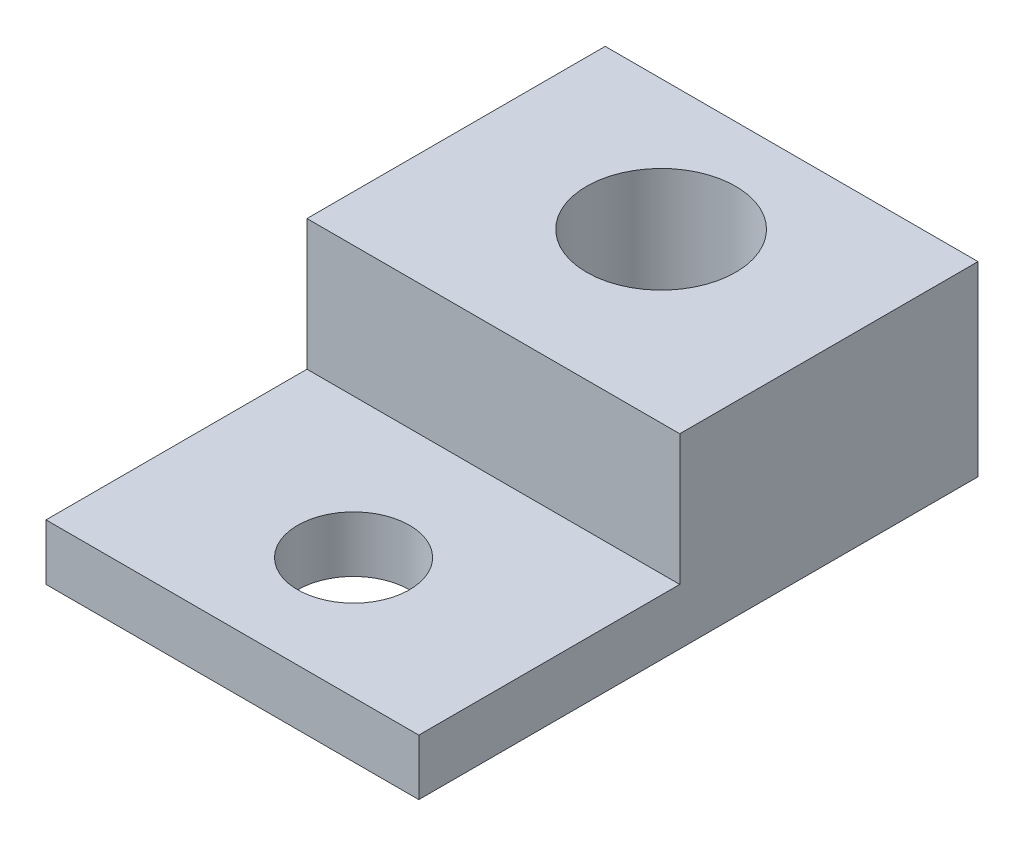
ISO-10303-21;
HEADER;
FILE_DESCRIPTION(('STEP AP214'),'2;1');
FILE_NAME('part.step','',(''),(''),'','','');
FILE_SCHEMA(('AUTOMOTIVE_DESIGN { 1 0 10303 214 1 1 1 1 }'));
ENDSEC;
DATA;
#1=APPLICATION_CONTEXT('core data for automotive mechanical design processes');
#2=APPLICATION_PROTOCOL_DEFINITION('international standard','automotive_design',2000,#1);
#3=PRODUCT_CONTEXT('',#1,'mechanical');
#4=PRODUCT('Part','Part','',(#3));
#5=PRODUCT_RELATED_PRODUCT_CATEGORY('part','',(#4));
#6=PRODUCT_DEFINITION_FORMATION('','',#4);
#7=PRODUCT_DEFINITION_CONTEXT('part definition',#1,'design');
#8=PRODUCT_DEFINITION('design','',#6,#7);
#9=PRODUCT_DEFINITION_SHAPE('','',#8);
#10=(LENGTH_UNIT() NAMED_UNIT(*) SI_UNIT(.MILLI.,.METRE.));
#11=(NAMED_UNIT(*) PLANE_ANGLE_UNIT() SI_UNIT($,.RADIAN.));
#12=(NAMED_UNIT(*) SI_UNIT($,.STERADIAN.) SOLID_ANGLE_UNIT());
#13=UNCERTAINTY_MEASURE_WITH_UNIT(LENGTH_MEASURE(1.E-05),#10,'distance_accuracy_value','');
#14=(GEOMETRIC_REPRESENTATION_CONTEXT(3) GLOBAL_UNCERTAINTY_ASSIGNED_CONTEXT((#13)) GLOBAL_UNIT_ASSIGNED_CONTEXT((#10,
#11,#12)) REPRESENTATION_CONTEXT('',''));
#15=CARTESIAN_POINT('',(0.,0.,0.));
#16=DIRECTION('',(0.,0.,1.));
#17=DIRECTION('',(1.,0.,0.));
#18=AXIS2_PLACEMENT_3D('',#15,#16,#17);
#19=CARTESIAN_POINT('',(0.,3.,0.));
#20=DIRECTION('',(0.,-1.,0.));
#21=DIRECTION('',(0.,0.,-1.));
#22=AXIS2_PLACEMENT_3D('',#19,#20,#21);
#23=PLANE('',#22);
#24=CARTESIAN_POINT('',(0.,3.,8.5));
#25=DIRECTION('',(0.,-1.,0.));
#26=DIRECTION('',(0.,0.,-1.));
#27=AXIS2_PLACEMENT_3D('',#24,#25,#26);
#28=CIRCLE('',#27,3.);
#29=CARTESIAN_POINT('',(0.,3.,5.5));
#30=VERTEX_POINT('',#29);
#31=EDGE_CURVE('E152',#30,#30,#28,.T.);
#32=ORIENTED_EDGE('',*,*,#31,.T.);
#33=EDGE_LOOP('',(#32));
#34=FACE_BOUND('',#33,.T.);
#35=DIRECTION('',(1.,0.,0.));
#36=VECTOR('',#35,1.);
#37=CARTESIAN_POINT('',(0.,3.,0.999999999999997));
#38=LINE('',#37,#36);
#39=CARTESIAN_POINT('',(-10.,3.,0.999999999999997));
#40=VERTEX_POINT('',#39);
#41=CARTESIAN_POINT('',(10.,3.,0.999999999999997));
#42=VERTEX_POINT('',#41);
#43=EDGE_CURVE('E58',#40,#42,#38,.T.);
#44=ORIENTED_EDGE('',*,*,#43,.F.);
#45=DIRECTION('',(0.,0.,1.));
#46=VECTOR('',#45,1.);
#47=CARTESIAN_POINT('',(-10.,3.,15.));
#48=LINE('',#47,#46);
#49=CARTESIAN_POINT('',(-10.,3.,15.));
#50=VERTEX_POINT('',#49);
#51=EDGE_CURVE('E127',#40,#50,#48,.T.);
#52=ORIENTED_EDGE('',*,*,#51,.T.);
#53=DIRECTION('',(1.,0.,0.));
#54=VECTOR('',#53,1.);
#55=CARTESIAN_POINT('',(-10.,3.,15.));
#56=LINE('',#55,#54);
#57=CARTESIAN_POINT('',(10.,3.,15.));
#58=VERTEX_POINT('',#57);
#59=EDGE_CURVE('E212',#50,#58,#56,.T.);
#60=ORIENTED_EDGE('',*,*,#59,.T.);
#61=DIRECTION('',(0.,0.,-1.));
#62=VECTOR('',#61,1.);
#63=CARTESIAN_POINT('',(10.,3.,15.));
#64=LINE('',#63,#62);
#65=EDGE_CURVE('E206',#58,#42,#64,.T.);
#66=ORIENTED_EDGE('',*,*,#65,.T.);
#67=EDGE_LOOP('',(#44,#52,#60,#66));
#68=FACE_BOUND('',#67,.T.);
#69=ADVANCED_FACE('F41',(#34,#68),#23,.F.);
#70=CARTESIAN_POINT('',(10.,3.,15.));
#71=DIRECTION('',(-1.,0.,0.));
#72=DIRECTION('',(0.,0.,1.));
#73=AXIS2_PLACEMENT_3D('',#70,#71,#72);
#74=PLANE('',#73);
#75=DIRECTION('',(0.,0.,-1.));
#76=VECTOR('',#75,1.);
#77=CARTESIAN_POINT('',(10.,0.,15.));
#78=LINE('',#77,#76);
#79=CARTESIAN_POINT('',(10.,0.,15.));
#80=VERTEX_POINT('',#79);
#81=CARTESIAN_POINT('',(10.,0.,-15.));
#82=VERTEX_POINT('',#81);
#83=EDGE_CURVE('E205',#80,#82,#78,.T.);
#84=ORIENTED_EDGE('',*,*,#83,.T.);
#85=DIRECTION('',(0.,-1.,0.));
#86=VECTOR('',#85,1.);
#87=CARTESIAN_POINT('',(10.,3.,-15.));
#88=LINE('',#87,#86);
#89=CARTESIAN_POINT('',(10.,10.,-15.));
#90=VERTEX_POINT('',#89);
#91=EDGE_CURVE('E51',#90,#82,#88,.T.);
#92=ORIENTED_EDGE('',*,*,#91,.F.);
#93=DIRECTION('',(0.,0.,-1.));
#94=VECTOR('',#93,1.);
#95=CARTESIAN_POINT('',(10.,10.,0.));
#96=LINE('',#95,#94);
#97=CARTESIAN_POINT('',(10.,10.,0.999999999999997));
#98=VERTEX_POINT('',#97);
#99=EDGE_CURVE('E140',#98,#90,#96,.T.);
#100=ORIENTED_EDGE('',*,*,#99,.F.);
#101=DIRECTION('',(0.,-1.,0.));
#102=VECTOR('',#101,1.);
#103=CARTESIAN_POINT('',(10.,35.6124969497314,0.999999999999997));
#104=LINE('',#103,#102);
#105=EDGE_CURVE('E130',#98,#42,#104,.T.);
#106=ORIENTED_EDGE('',*,*,#105,.T.);
#107=ORIENTED_EDGE('',*,*,#65,.F.);
#108=DIRECTION('',(0.,-1.,0.));
#109=VECTOR('',#108,1.);
#110=CARTESIAN_POINT('',(10.,3.,15.));
#111=LINE('',#110,#109);
#112=EDGE_CURVE('E215',#58,#80,#111,.T.);
#113=ORIENTED_EDGE('',*,*,#112,.T.);
#114=EDGE_LOOP('',(#84,#92,#100,#106,#107,#113));
#115=FACE_BOUND('',#114,.T.);
#116=ADVANCED_FACE('F43',(#115),#74,.F.);
#117=CARTESIAN_POINT('',(-10.,3.,-15.));
#118=DIRECTION('',(0.,0.,1.));
#119=DIRECTION('',(1.,0.,0.));
#120=AXIS2_PLACEMENT_3D('',#117,#118,#119);
#121=PLANE('',#120);
#122=DIRECTION('',(-1.,0.,0.));
#123=VECTOR('',#122,1.);
#124=CARTESIAN_POINT('',(-10.,0.,-15.));
#125=LINE('',#124,#123);
#126=CARTESIAN_POINT('',(2.5,0.,-15.));
#127=VERTEX_POINT('',#126);
#128=EDGE_CURVE('E220',#82,#127,#125,.T.);
#129=ORIENTED_EDGE('',*,*,#128,.T.);
#130=DIRECTION('',(0.,1.,0.));
#131=VECTOR('',#130,1.);
#132=CARTESIAN_POINT('',(2.5,-3.,-15.));
#133=LINE('',#132,#131);
#134=CARTESIAN_POINT('',(2.5,-3.,-15.));
#135=VERTEX_POINT('',#134);
#136=EDGE_CURVE('E182',#135,#127,#133,.T.);
#137=ORIENTED_EDGE('',*,*,#136,.F.);
#138=DIRECTION('',(1.,0.,0.));
#139=VECTOR('',#138,1.);
#140=CARTESIAN_POINT('',(-2.5,-3.,-15.));
#141=LINE('',#140,#139);
#142=CARTESIAN_POINT('',(-2.5,-3.,-15.));
#143=VERTEX_POINT('',#142);
#144=EDGE_CURVE('E179',#143,#135,#141,.T.);
#145=ORIENTED_EDGE('',*,*,#144,.F.);
#146=DIRECTION('',(0.,1.,0.));
#147=VECTOR('',#146,1.);
#148=CARTESIAN_POINT('',(-2.5,-3.,-15.));
#149=LINE('',#148,#147);
#150=CARTESIAN_POINT('',(-2.5,0.,-15.));
#151=VERTEX_POINT('',#150);
#152=EDGE_CURVE('E194',#143,#151,#149,.T.);
#153=ORIENTED_EDGE('',*,*,#152,.T.);
#154=CARTESIAN_POINT('',(-10.,0.,-15.));
#155=VERTEX_POINT('',#154);
#156=EDGE_CURVE('E219',#151,#155,#125,.T.);
#157=ORIENTED_EDGE('',*,*,#156,.T.);
#158=DIRECTION('',(0.,-1.,0.));
#159=VECTOR('',#158,1.);
#160=CARTESIAN_POINT('',(-10.,3.,-15.));
#161=LINE('',#160,#159);
#162=CARTESIAN_POINT('',(-10.,10.,-15.));
#163=VERTEX_POINT('',#162);
#164=EDGE_CURVE('E236',#163,#155,#161,.T.);
#165=ORIENTED_EDGE('',*,*,#164,.F.);
#166=DIRECTION('',(-1.,0.,0.));
#167=VECTOR('',#166,1.);
#168=CARTESIAN_POINT('',(0.,10.,-15.));
#169=LINE('',#168,#167);
#170=EDGE_CURVE('E146',#90,#163,#169,.T.);
#171=ORIENTED_EDGE('',*,*,#170,.F.);
#172=ORIENTED_EDGE('',*,*,#91,.T.);
#173=EDGE_LOOP('',(#129,#137,#145,#153,#157,#165,#171,#172));
#174=FACE_BOUND('',#173,.T.);
#175=ADVANCED_FACE('F242',(#174),#121,.F.);
#176=CARTESIAN_POINT('',(-10.,3.,15.));
#177=DIRECTION('',(1.,0.,0.));
#178=DIRECTION('',(0.,0.,-1.));
#179=AXIS2_PLACEMENT_3D('',#176,#177,#178);
#180=PLANE('',#179);
#181=DIRECTION('',(0.,0.,1.));
#182=VECTOR('',#181,1.);
#183=CARTESIAN_POINT('',(-10.,0.,15.));
#184=LINE('',#183,#182);
#185=CARTESIAN_POINT('',(-10.,0.,15.));
#186=VERTEX_POINT('',#185);
#187=EDGE_CURVE('E224',#155,#186,#184,.T.);
#188=ORIENTED_EDGE('',*,*,#187,.T.);
#189=DIRECTION('',(0.,-1.,0.));
#190=VECTOR('',#189,1.);
#191=CARTESIAN_POINT('',(-10.,3.,15.));
#192=LINE('',#191,#190);
#193=EDGE_CURVE('E232',#50,#186,#192,.T.);
#194=ORIENTED_EDGE('',*,*,#193,.F.);
#195=ORIENTED_EDGE('',*,*,#51,.F.);
#196=DIRECTION('',(0.,-1.,0.));
#197=VECTOR('',#196,1.);
#198=CARTESIAN_POINT('',(-10.,35.6124969497314,0.999999999999997));
#199=LINE('',#198,#197);
#200=CARTESIAN_POINT('',(-10.,10.,0.999999999999997));
#201=VERTEX_POINT('',#200);
#202=EDGE_CURVE('E120',#201,#40,#199,.T.);
#203=ORIENTED_EDGE('',*,*,#202,.F.);
#204=DIRECTION('',(0.,0.,1.));
#205=VECTOR('',#204,1.);
#206=CARTESIAN_POINT('',(-10.,10.,0.));
#207=LINE('',#206,#205);
#208=EDGE_CURVE('E125',#163,#201,#207,.T.);
#209=ORIENTED_EDGE('',*,*,#208,.F.);
#210=ORIENTED_EDGE('',*,*,#164,.T.);
#211=EDGE_LOOP('',(#188,#194,#195,#203,#209,#210));
#212=FACE_BOUND('',#211,.T.);
#213=ADVANCED_FACE('F122',(#212),#180,.F.);
#214=CARTESIAN_POINT('',(-10.,3.,15.));
#215=DIRECTION('',(0.,0.,-1.));
#216=DIRECTION('',(-1.,0.,0.));
#217=AXIS2_PLACEMENT_3D('',#214,#215,#216);
#218=PLANE('',#217);
#219=DIRECTION('',(1.,0.,0.));
#220=VECTOR('',#219,1.);
#221=CARTESIAN_POINT('',(-10.,0.,15.));
#222=LINE('',#221,#220);
#223=EDGE_CURVE('E209',#186,#80,#222,.T.);
#224=ORIENTED_EDGE('',*,*,#223,.T.);
#225=ORIENTED_EDGE('',*,*,#112,.F.);
#226=ORIENTED_EDGE('',*,*,#59,.F.);
#227=ORIENTED_EDGE('',*,*,#193,.T.);
#228=EDGE_LOOP('',(#224,#225,#226,#227));
#229=FACE_BOUND('',#228,.T.);
#230=ADVANCED_FACE('F282',(#229),#218,.F.);
#231=CARTESIAN_POINT('',(0.,0.,0.));
#232=DIRECTION('',(0.,-1.,0.));
#233=DIRECTION('',(0.,0.,-1.));
#234=AXIS2_PLACEMENT_3D('',#231,#232,#233);
#235=PLANE('',#234);
#236=CARTESIAN_POINT('',(0.,0.,8.5));
#237=DIRECTION('',(0.,-1.,0.));
#238=DIRECTION('',(0.,0.,-1.));
#239=AXIS2_PLACEMENT_3D('',#236,#237,#238);
#240=CIRCLE('',#239,3.);
#241=CARTESIAN_POINT('',(0.,0.,5.5));
#242=VERTEX_POINT('',#241);
#243=EDGE_CURVE('E45',#242,#242,#240,.T.);
#244=ORIENTED_EDGE('',*,*,#243,.F.);
#245=EDGE_LOOP('',(#244));
#246=FACE_BOUND('',#245,.T.);
#247=DIRECTION('',(0.,0.,1.));
#248=VECTOR('',#247,1.);
#249=CARTESIAN_POINT('',(2.5,0.,-15.));
#250=LINE('',#249,#248);
#251=CARTESIAN_POINT('',(2.5,0.,-3.));
#252=VERTEX_POINT('',#251);
#253=EDGE_CURVE('E167',#127,#252,#250,.T.);
#254=ORIENTED_EDGE('',*,*,#253,.F.);
#255=ORIENTED_EDGE('',*,*,#128,.F.);
#256=ORIENTED_EDGE('',*,*,#83,.F.);
#257=ORIENTED_EDGE('',*,*,#223,.F.);
#258=ORIENTED_EDGE('',*,*,#187,.F.);
#259=ORIENTED_EDGE('',*,*,#156,.F.);
#260=DIRECTION('',(0.,0.,-1.));
#261=VECTOR('',#260,1.);
#262=CARTESIAN_POINT('',(-2.5,0.,-15.));
#263=LINE('',#262,#261);
#264=CARTESIAN_POINT('',(-2.5,0.,-3.));
#265=VERTEX_POINT('',#264);
#266=EDGE_CURVE('E173',#265,#151,#263,.T.);
#267=ORIENTED_EDGE('',*,*,#266,.F.);
#268=DIRECTION('',(-1.,0.,0.));
#269=VECTOR('',#268,1.);
#270=CARTESIAN_POINT('',(-2.5,0.,-3.));
#271=LINE('',#270,#269);
#272=EDGE_CURVE('E66',#252,#265,#271,.T.);
#273=ORIENTED_EDGE('',*,*,#272,.F.);
#274=EDGE_LOOP('',(#254,#255,#256,#257,#258,#259,#267,#273));
#275=FACE_BOUND('',#274,.T.);
#276=ADVANCED_FACE('F249',(#246,#275),#235,.T.);
#277=CARTESIAN_POINT('',(2.5,-3.,-15.));
#278=DIRECTION('',(-1.,0.,0.));
#279=DIRECTION('',(0.,0.,1.));
#280=AXIS2_PLACEMENT_3D('',#277,#278,#279);
#281=PLANE('',#280);
#282=ORIENTED_EDGE('',*,*,#253,.T.);
#283=DIRECTION('',(0.,1.,0.));
#284=VECTOR('',#283,1.);
#285=CARTESIAN_POINT('',(2.5,-3.,-3.));
#286=LINE('',#285,#284);
#287=CARTESIAN_POINT('',(2.5,-3.,-3.));
#288=VERTEX_POINT('',#287);
#289=EDGE_CURVE('E202',#288,#252,#286,.T.);
#290=ORIENTED_EDGE('',*,*,#289,.F.);
#291=DIRECTION('',(0.,0.,1.));
#292=VECTOR('',#291,1.);
#293=CARTESIAN_POINT('',(2.5,-3.,-15.));
#294=LINE('',#293,#292);
#295=EDGE_CURVE('E168',#135,#288,#294,.T.);
#296=ORIENTED_EDGE('',*,*,#295,.F.);
#297=ORIENTED_EDGE('',*,*,#136,.T.);
#298=EDGE_LOOP('',(#282,#290,#296,#297));
#299=FACE_BOUND('',#298,.T.);
#300=ADVANCED_FACE('F253',(#299),#281,.F.);
#301=CARTESIAN_POINT('',(-2.5,-3.,-3.));
#302=DIRECTION('',(0.,0.,-1.));
#303=DIRECTION('',(-1.,0.,0.));
#304=AXIS2_PLACEMENT_3D('',#301,#302,#303);
#305=PLANE('',#304);
#306=ORIENTED_EDGE('',*,*,#272,.T.);
#307=DIRECTION('',(0.,1.,0.));
#308=VECTOR('',#307,1.);
#309=CARTESIAN_POINT('',(-2.5,-3.,-3.));
#310=LINE('',#309,#308);
#311=CARTESIAN_POINT('',(-2.5,-3.,-3.));
#312=VERTEX_POINT('',#311);
#313=EDGE_CURVE('E198',#312,#265,#310,.T.);
#314=ORIENTED_EDGE('',*,*,#313,.F.);
#315=DIRECTION('',(-1.,0.,0.));
#316=VECTOR('',#315,1.);
#317=CARTESIAN_POINT('',(-2.5,-3.,-3.));
#318=LINE('',#317,#316);
#319=EDGE_CURVE('E172',#288,#312,#318,.T.);
#320=ORIENTED_EDGE('',*,*,#319,.F.);
#321=ORIENTED_EDGE('',*,*,#289,.T.);
#322=EDGE_LOOP('',(#306,#314,#320,#321));
#323=FACE_BOUND('',#322,.T.);
#324=ADVANCED_FACE('F264',(#323),#305,.F.);
#325=CARTESIAN_POINT('',(-2.5,-3.,-15.));
#326=DIRECTION('',(1.,0.,0.));
#327=DIRECTION('',(0.,0.,-1.));
#328=AXIS2_PLACEMENT_3D('',#325,#326,#327);
#329=PLANE('',#328);
#330=ORIENTED_EDGE('',*,*,#266,.T.);
#331=ORIENTED_EDGE('',*,*,#152,.F.);
#332=DIRECTION('',(0.,0.,-1.));
#333=VECTOR('',#332,1.);
#334=CARTESIAN_POINT('',(-2.5,-3.,-15.));
#335=LINE('',#334,#333);
#336=EDGE_CURVE('E176',#312,#143,#335,.T.);
#337=ORIENTED_EDGE('',*,*,#336,.F.);
#338=ORIENTED_EDGE('',*,*,#313,.T.);
#339=EDGE_LOOP('',(#330,#331,#337,#338));
#340=FACE_BOUND('',#339,.T.);
#341=ADVANCED_FACE('F262',(#340),#329,.F.);
#342=CARTESIAN_POINT('',(0.,-3.,0.));
#343=DIRECTION('',(0.,1.,0.));
#344=DIRECTION('',(0.,0.,1.));
#345=AXIS2_PLACEMENT_3D('',#342,#343,#344);
#346=PLANE('',#345);
#347=ORIENTED_EDGE('',*,*,#295,.T.);
#348=ORIENTED_EDGE('',*,*,#319,.T.);
#349=ORIENTED_EDGE('',*,*,#336,.T.);
#350=ORIENTED_EDGE('',*,*,#144,.T.);
#351=EDGE_LOOP('',(#347,#348,#349,#350));
#352=FACE_BOUND('',#351,.T.);
#353=ADVANCED_FACE('F258',(#352),#346,.F.);
#354=CARTESIAN_POINT('',(0.,-3.,8.5));
#355=DIRECTION('',(0.,1.,0.));
#356=DIRECTION('',(0.,0.,1.));
#357=AXIS2_PLACEMENT_3D('',#354,#355,#356);
#358=CYLINDRICAL_SURFACE('',#357,3.);
#359=ORIENTED_EDGE('',*,*,#243,.T.);
#360=EDGE_LOOP('',(#359));
#361=FACE_BOUND('',#360,.T.);
#362=ORIENTED_EDGE('',*,*,#31,.F.);
#363=EDGE_LOOP('',(#362));
#364=FACE_BOUND('',#363,.T.);
#365=ADVANCED_FACE('F332',(#361,#364),#358,.F.);
#366=CARTESIAN_POINT('',(0.,35.6124969497314,0.999999999999997));
#367=DIRECTION('',(0.,0.,-1.));
#368=DIRECTION('',(-1.,0.,0.));
#369=AXIS2_PLACEMENT_3D('',#366,#367,#368);
#370=PLANE('',#369);
#371=DIRECTION('',(1.,0.,0.));
#372=VECTOR('',#371,1.);
#373=CARTESIAN_POINT('',(0.,10.,0.999999999999997));
#374=LINE('',#373,#372);
#375=EDGE_CURVE('E133',#201,#98,#374,.T.);
#376=ORIENTED_EDGE('',*,*,#375,.F.);
#377=ORIENTED_EDGE('',*,*,#202,.T.);
#378=ORIENTED_EDGE('',*,*,#43,.T.);
#379=ORIENTED_EDGE('',*,*,#105,.F.);
#380=EDGE_LOOP('',(#376,#377,#378,#379));
#381=FACE_BOUND('',#380,.T.);
#382=ADVANCED_FACE('F134',(#381),#370,.F.);
#383=CARTESIAN_POINT('',(0.,4.,-8.));
#384=DIRECTION('',(0.,1.,0.));
#385=DIRECTION('',(0.,0.,1.));
#386=AXIS2_PLACEMENT_3D('',#383,#384,#385);
#387=PLANE('',#386);
#388=CARTESIAN_POINT('',(0.,4.,-8.));
#389=DIRECTION('',(0.,1.,0.));
#390=DIRECTION('',(0.,0.,1.));
#391=AXIS2_PLACEMENT_3D('',#388,#389,#390);
#392=CIRCLE('',#391,4.);
#393=CARTESIAN_POINT('',(0.,4.,-4.));
#394=VERTEX_POINT('',#393);
#395=EDGE_CURVE('E11',#394,#394,#392,.T.);
#396=ORIENTED_EDGE('',*,*,#395,.T.);
#397=EDGE_LOOP('',(#396));
#398=FACE_BOUND('',#397,.T.);
#399=ADVANCED_FACE('F343',(#398),#387,.T.);
#400=CARTESIAN_POINT('',(0.,10.,-8.));
#401=DIRECTION('',(0.,-1.,0.));
#402=DIRECTION('',(0.,0.,-1.));
#403=AXIS2_PLACEMENT_3D('',#400,#401,#402);
#404=CYLINDRICAL_SURFACE('',#403,4.);
#405=ORIENTED_EDGE('',*,*,#395,.F.);
#406=EDGE_LOOP('',(#405));
#407=FACE_BOUND('',#406,.T.);
#408=CARTESIAN_POINT('',(0.,10.,-8.));
#409=DIRECTION('',(0.,1.,0.));
#410=DIRECTION('',(0.,0.,1.));
#411=AXIS2_PLACEMENT_3D('',#408,#409,#410);
#412=CIRCLE('',#411,4.);
#413=CARTESIAN_POINT('',(0.,10.,-4.));
#414=VERTEX_POINT('',#413);
#415=EDGE_CURVE('E163',#414,#414,#412,.T.);
#416=ORIENTED_EDGE('',*,*,#415,.T.);
#417=EDGE_LOOP('',(#416));
#418=FACE_BOUND('',#417,.T.);
#419=ADVANCED_FACE('F339',(#407,#418),#404,.F.);
#420=CARTESIAN_POINT('',(0.,10.,-8.));
#421=DIRECTION('',(0.,1.,0.));
#422=DIRECTION('',(0.,0.,1.));
#423=AXIS2_PLACEMENT_3D('',#420,#421,#422);
#424=PLANE('',#423);
#425=ORIENTED_EDGE('',*,*,#170,.T.);
#426=ORIENTED_EDGE('',*,*,#208,.T.);
#427=ORIENTED_EDGE('',*,*,#375,.T.);
#428=ORIENTED_EDGE('',*,*,#99,.T.);
#429=EDGE_LOOP('',(#425,#426,#427,#428));
#430=FACE_BOUND('',#429,.T.);
#431=ORIENTED_EDGE('',*,*,#415,.F.);
#432=EDGE_LOOP('',(#431));
#433=FACE_BOUND('',#432,.T.);
#434=ADVANCED_FACE('F143',(#430,#433),#424,.T.);
#435=CLOSED_SHELL('',(#69,#116,#175,#213,#230,#276,#300,#324,#341,#353,#365,#382,#399,#419,#434));
#436=MANIFOLD_SOLID_BREP('B2',#435);
#437=ADVANCED_BREP_SHAPE_REPRESENTATION('',(#18,#436),#14);
#438=SHAPE_DEFINITION_REPRESENTATION(#9,#437);
ENDSEC;
END-ISO-10303-21;
